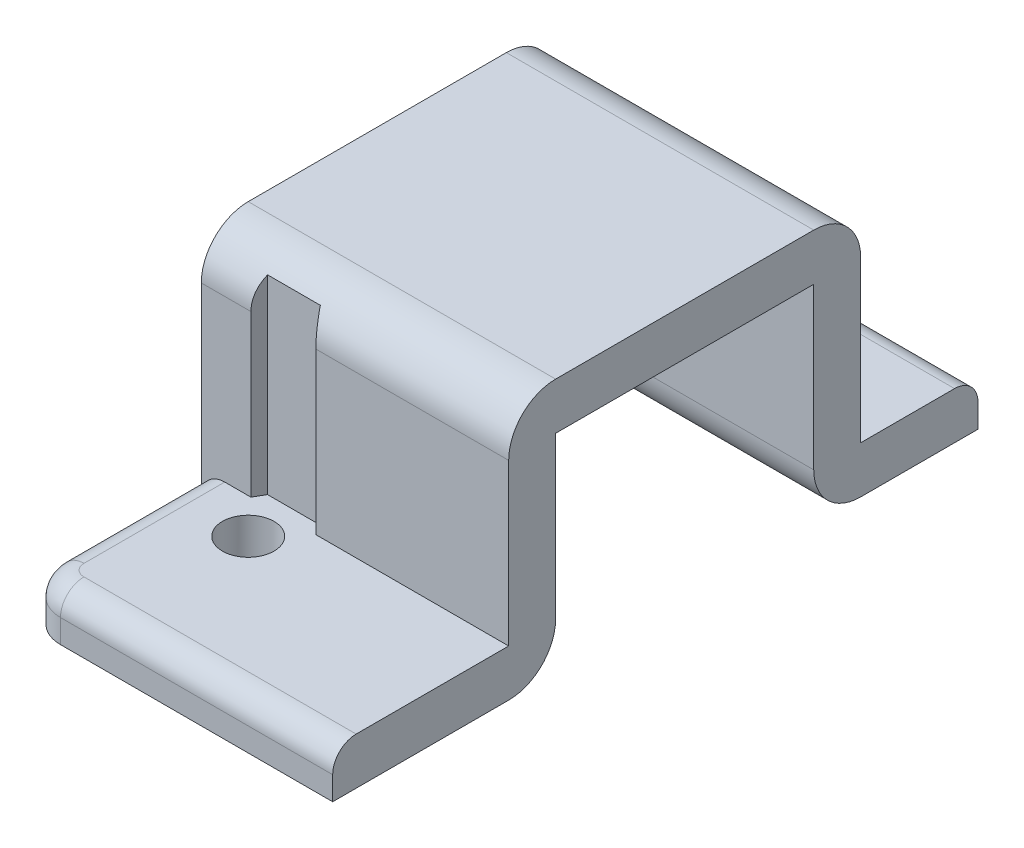
ISO-10303-21;
HEADER;
FILE_DESCRIPTION(('STEP AP214'),'2;1');
FILE_NAME('part.step','',(''),(''),'','','');
FILE_SCHEMA(('AUTOMOTIVE_DESIGN { 1 0 10303 214 1 1 1 1 }'));
ENDSEC;
DATA;
#1=APPLICATION_CONTEXT('core data for automotive mechanical design processes');
#2=APPLICATION_PROTOCOL_DEFINITION('international standard','automotive_design',2000,#1);
#3=PRODUCT_CONTEXT('',#1,'mechanical');
#4=PRODUCT('Part','Part','',(#3));
#5=PRODUCT_RELATED_PRODUCT_CATEGORY('part','',(#4));
#6=PRODUCT_DEFINITION_FORMATION('','',#4);
#7=PRODUCT_DEFINITION_CONTEXT('part definition',#1,'design');
#8=PRODUCT_DEFINITION('design','',#6,#7);
#9=PRODUCT_DEFINITION_SHAPE('','',#8);
#10=(LENGTH_UNIT() NAMED_UNIT(*) SI_UNIT(.MILLI.,.METRE.));
#11=(NAMED_UNIT(*) PLANE_ANGLE_UNIT() SI_UNIT($,.RADIAN.));
#12=(NAMED_UNIT(*) SI_UNIT($,.STERADIAN.) SOLID_ANGLE_UNIT());
#13=UNCERTAINTY_MEASURE_WITH_UNIT(LENGTH_MEASURE(1.E-05),#10,'distance_accuracy_value','');
#14=(GEOMETRIC_REPRESENTATION_CONTEXT(3) GLOBAL_UNCERTAINTY_ASSIGNED_CONTEXT((#13)) GLOBAL_UNIT_ASSIGNED_CONTEXT((#10,
#11,#12)) REPRESENTATION_CONTEXT('',''));
#15=CARTESIAN_POINT('',(0.,0.,0.));
#16=DIRECTION('',(0.,0.,1.));
#17=DIRECTION('',(1.,0.,0.));
#18=AXIS2_PLACEMENT_3D('',#15,#16,#17);
#19=CARTESIAN_POINT('',(6.55,0.,-7.5));
#20=DIRECTION('',(0.,0.,1.));
#21=DIRECTION('',(0.,-1.,0.));
#22=AXIS2_PLACEMENT_3D('',#19,#20,#21);
#23=PLANE('',#22);
#24=DIRECTION('',(0.,1.,0.));
#25=VECTOR('',#24,1.);
#26=CARTESIAN_POINT('',(-6.55,0.,-7.5));
#27=LINE('',#26,#25);
#28=CARTESIAN_POINT('',(-6.55,1.,-7.5));
#29=VERTEX_POINT('',#28);
#30=CARTESIAN_POINT('',(-6.55,8.85,-7.5));
#31=VERTEX_POINT('',#30);
#32=EDGE_CURVE('E500',#29,#31,#27,.T.);
#33=ORIENTED_EDGE('',*,*,#32,.T.);
#34=DIRECTION('',(1.,0.,0.));
#35=VECTOR('',#34,1.);
#36=CARTESIAN_POINT('',(-5.49198729810778,8.85,-7.5));
#37=LINE('',#36,#35);
#38=CARTESIAN_POINT('',(-4.43397459621556,8.85,-7.5));
#39=VERTEX_POINT('',#38);
#40=EDGE_CURVE('E266',#31,#39,#37,.T.);
#41=ORIENTED_EDGE('',*,*,#40,.T.);
#42=DIRECTION('',(0.,1.,0.));
#43=VECTOR('',#42,1.);
#44=CARTESIAN_POINT('',(-4.43397459621556,10.851,-7.5));
#45=LINE('',#44,#43);
#46=CARTESIAN_POINT('',(-4.43397459621556,2.,-7.5));
#47=VERTEX_POINT('',#46);
#48=EDGE_CURVE('E249',#47,#39,#45,.T.);
#49=ORIENTED_EDGE('',*,*,#48,.F.);
#50=DIRECTION('',(-1.,0.,0.));
#51=VECTOR('',#50,1.);
#52=CARTESIAN_POINT('',(6.55,2.,-7.5));
#53=LINE('',#52,#51);
#54=CARTESIAN_POINT('',(-5.55,2.,-7.5));
#55=VERTEX_POINT('',#54);
#56=EDGE_CURVE('E263',#47,#55,#53,.T.);
#57=ORIENTED_EDGE('',*,*,#56,.T.);
#58=CARTESIAN_POINT('',(-5.55,1.,-7.5));
#59=DIRECTION('',(0.,0.,1.));
#60=DIRECTION('',(0.,-1.,0.));
#61=AXIS2_PLACEMENT_3D('',#58,#59,#60);
#62=CIRCLE('',#61,1.);
#63=EDGE_CURVE('E11',#55,#29,#62,.T.);
#64=ORIENTED_EDGE('',*,*,#63,.T.);
#65=EDGE_LOOP('',(#33,#41,#49,#57,#64));
#66=FACE_BOUND('',#65,.T.);
#67=ADVANCED_FACE('F43',(#66),#23,.F.);
#68=CARTESIAN_POINT('',(6.55,10.85,0.));
#69=DIRECTION('',(0.,1.,0.));
#70=DIRECTION('',(0.,0.,1.));
#71=AXIS2_PLACEMENT_3D('',#68,#69,#70);
#72=PLANE('',#71);
#73=DIRECTION('',(0.,0.,-1.));
#74=VECTOR('',#73,1.);
#75=CARTESIAN_POINT('',(-6.55,10.85,0.));
#76=LINE('',#75,#74);
#77=CARTESIAN_POINT('',(-6.55,10.85,5.5));
#78=VERTEX_POINT('',#77);
#79=CARTESIAN_POINT('',(-6.55,10.85,-5.5));
#80=VERTEX_POINT('',#79);
#81=EDGE_CURVE('E503',#78,#80,#76,.T.);
#82=ORIENTED_EDGE('',*,*,#81,.F.);
#83=DIRECTION('',(-1.,0.,0.));
#84=VECTOR('',#83,1.);
#85=CARTESIAN_POINT('',(6.55,10.85,5.5));
#86=LINE('',#85,#84);
#87=CARTESIAN_POINT('',(6.55,10.85,5.5));
#88=VERTEX_POINT('',#87);
#89=EDGE_CURVE('E343',#78,#88,#86,.F.);
#90=ORIENTED_EDGE('',*,*,#89,.T.);
#91=DIRECTION('',(0.,0.,-1.));
#92=VECTOR('',#91,1.);
#93=CARTESIAN_POINT('',(6.55,10.85,0.));
#94=LINE('',#93,#92);
#95=CARTESIAN_POINT('',(6.55,10.85,-5.5));
#96=VERTEX_POINT('',#95);
#97=EDGE_CURVE('E459',#88,#96,#94,.T.);
#98=ORIENTED_EDGE('',*,*,#97,.T.);
#99=DIRECTION('',(-1.,0.,0.));
#100=VECTOR('',#99,1.);
#101=CARTESIAN_POINT('',(-1.66602540378444,10.85,-5.5));
#102=LINE('',#101,#100);
#103=EDGE_CURVE('E339',#96,#80,#102,.T.);
#104=ORIENTED_EDGE('',*,*,#103,.T.);
#105=EDGE_LOOP('',(#82,#90,#98,#104));
#106=FACE_BOUND('',#105,.T.);
#107=ADVANCED_FACE('F684',(#106),#72,.T.);
#108=CARTESIAN_POINT('',(6.55,0.,7.5));
#109=DIRECTION('',(0.,0.,1.));
#110=DIRECTION('',(0.,-1.,0.));
#111=AXIS2_PLACEMENT_3D('',#108,#109,#110);
#112=PLANE('',#111);
#113=DIRECTION('',(0.,-1.,0.));
#114=VECTOR('',#113,1.);
#115=CARTESIAN_POINT('',(-4.43397459621556,10.851,7.5));
#116=LINE('',#115,#114);
#117=CARTESIAN_POINT('',(-4.43397459621556,8.85,7.5));
#118=VERTEX_POINT('',#117);
#119=CARTESIAN_POINT('',(-4.43397459621556,2.,7.5));
#120=VERTEX_POINT('',#119);
#121=EDGE_CURVE('E644',#118,#120,#116,.T.);
#122=ORIENTED_EDGE('',*,*,#121,.F.);
#123=DIRECTION('',(-1.,0.,0.));
#124=VECTOR('',#123,1.);
#125=CARTESIAN_POINT('',(-5.49198729810778,8.85,7.5));
#126=LINE('',#125,#124);
#127=CARTESIAN_POINT('',(-6.55,8.85,7.5));
#128=VERTEX_POINT('',#127);
#129=EDGE_CURVE('E336',#118,#128,#126,.T.);
#130=ORIENTED_EDGE('',*,*,#129,.T.);
#131=DIRECTION('',(0.,1.,0.));
#132=VECTOR('',#131,1.);
#133=CARTESIAN_POINT('',(-6.55,0.,7.5));
#134=LINE('',#133,#132);
#135=CARTESIAN_POINT('',(-6.55,1.,7.5));
#136=VERTEX_POINT('',#135);
#137=EDGE_CURVE('E508',#136,#128,#134,.T.);
#138=ORIENTED_EDGE('',*,*,#137,.F.);
#139=CARTESIAN_POINT('',(-5.55,1.,7.5));
#140=DIRECTION('',(0.,0.,1.));
#141=DIRECTION('',(0.,-1.,0.));
#142=AXIS2_PLACEMENT_3D('',#139,#140,#141);
#143=CIRCLE('',#142,1.);
#144=CARTESIAN_POINT('',(-5.55,2.,7.5));
#145=VERTEX_POINT('',#144);
#146=EDGE_CURVE('E53',#136,#145,#143,.F.);
#147=ORIENTED_EDGE('',*,*,#146,.T.);
#148=DIRECTION('',(-1.,0.,0.));
#149=VECTOR('',#148,1.);
#150=CARTESIAN_POINT('',(6.55,2.,7.5));
#151=LINE('',#150,#149);
#152=EDGE_CURVE('E282',#120,#145,#151,.T.);
#153=ORIENTED_EDGE('',*,*,#152,.F.);
#154=EDGE_LOOP('',(#122,#130,#138,#147,#153));
#155=FACE_BOUND('',#154,.T.);
#156=ADVANCED_FACE('F690',(#155),#112,.T.);
#157=DIRECTION('',(0.,1.,0.));
#158=VECTOR('',#157,1.);
#159=CARTESIAN_POINT('',(6.55,0.,7.5));
#160=LINE('',#159,#158);
#161=CARTESIAN_POINT('',(6.55,2.,7.5));
#162=VERTEX_POINT('',#161);
#163=CARTESIAN_POINT('',(6.55,8.85,7.5));
#164=VERTEX_POINT('',#163);
#165=EDGE_CURVE('E471',#162,#164,#160,.T.);
#166=ORIENTED_EDGE('',*,*,#165,.T.);
#167=DIRECTION('',(-1.,0.,0.));
#168=VECTOR('',#167,1.);
#169=CARTESIAN_POINT('',(6.55,8.85,7.5));
#170=LINE('',#169,#168);
#171=CARTESIAN_POINT('',(-1.66602540378444,8.85,7.5));
#172=VERTEX_POINT('',#171);
#173=EDGE_CURVE('E323',#164,#172,#170,.T.);
#174=ORIENTED_EDGE('',*,*,#173,.T.);
#175=DIRECTION('',(0.,1.,0.));
#176=VECTOR('',#175,1.);
#177=CARTESIAN_POINT('',(-1.66602540378444,10.851,7.5));
#178=LINE('',#177,#176);
#179=CARTESIAN_POINT('',(-1.66602540378444,2.,7.5));
#180=VERTEX_POINT('',#179);
#181=EDGE_CURVE('E639',#180,#172,#178,.T.);
#182=ORIENTED_EDGE('',*,*,#181,.F.);
#183=EDGE_CURVE('E275',#162,#180,#151,.T.);
#184=ORIENTED_EDGE('',*,*,#183,.F.);
#185=EDGE_LOOP('',(#166,#174,#182,#184));
#186=FACE_BOUND('',#185,.T.);
#187=ADVANCED_FACE('F702',(#186),#112,.T.);
#188=CARTESIAN_POINT('',(6.55,2.,0.));
#189=DIRECTION('',(0.,1.,0.));
#190=DIRECTION('',(0.,0.,1.));
#191=AXIS2_PLACEMENT_3D('',#188,#189,#190);
#192=PLANE('',#191);
#193=CARTESIAN_POINT('',(-3.05,2.,-9.));
#194=DIRECTION('',(0.,-1.,0.));
#195=DIRECTION('',(0.,0.,-1.));
#196=AXIS2_PLACEMENT_3D('',#193,#194,#195);
#197=CIRCLE('',#196,1.1);
#198=CARTESIAN_POINT('',(-3.05,2.,-10.1));
#199=VERTEX_POINT('',#198);
#200=EDGE_CURVE('E631',#199,#199,#197,.T.);
#201=ORIENTED_EDGE('',*,*,#200,.T.);
#202=EDGE_LOOP('',(#201));
#203=FACE_BOUND('',#202,.T.);
#204=CARTESIAN_POINT('',(-5.05,2.,-11.));
#205=DIRECTION('',(0.,1.,0.));
#206=DIRECTION('',(0.,0.,1.));
#207=AXIS2_PLACEMENT_3D('',#204,#205,#206);
#208=CIRCLE('',#207,0.5);
#209=CARTESIAN_POINT('',(-5.05,2.,-11.5));
#210=VERTEX_POINT('',#209);
#211=CARTESIAN_POINT('',(-5.55,2.,-11.));
#212=VERTEX_POINT('',#211);
#213=EDGE_CURVE('E403',#210,#212,#208,.T.);
#214=ORIENTED_EDGE('',*,*,#213,.T.);
#215=DIRECTION('',(0.,0.,-1.));
#216=VECTOR('',#215,1.);
#217=CARTESIAN_POINT('',(-5.55,2.,-7.5));
#218=LINE('',#217,#216);
#219=EDGE_CURVE('E272',#212,#55,#218,.F.);
#220=ORIENTED_EDGE('',*,*,#219,.T.);
#221=ORIENTED_EDGE('',*,*,#56,.F.);
#222=DIRECTION('',(-0.5,0.,-0.866025403784439));
#223=VECTOR('',#222,1.);
#224=CARTESIAN_POINT('',(-4.175,2.,-7.05144284148501));
#225=LINE('',#224,#223);
#226=CARTESIAN_POINT('',(-4.175,2.,-7.05144284148501));
#227=VERTEX_POINT('',#226);
#228=EDGE_CURVE('E246',#227,#47,#225,.T.);
#229=ORIENTED_EDGE('',*,*,#228,.F.);
#230=DIRECTION('',(-1.,0.,0.));
#231=VECTOR('',#230,1.);
#232=CARTESIAN_POINT('',(-1.925,2.,-7.05144284148501));
#233=LINE('',#232,#231);
#234=CARTESIAN_POINT('',(-1.925,2.,-7.05144284148501));
#235=VERTEX_POINT('',#234);
#236=EDGE_CURVE('E258',#235,#227,#233,.T.);
#237=ORIENTED_EDGE('',*,*,#236,.F.);
#238=DIRECTION('',(-0.5,0.,0.866025403784439));
#239=VECTOR('',#238,1.);
#240=CARTESIAN_POINT('',(-0.8,2.,-9.));
#241=LINE('',#240,#239);
#242=CARTESIAN_POINT('',(-1.66602540378444,2.,-7.5));
#243=VERTEX_POINT('',#242);
#244=EDGE_CURVE('E633',#243,#235,#241,.T.);
#245=ORIENTED_EDGE('',*,*,#244,.F.);
#246=CARTESIAN_POINT('',(6.55,2.,-7.5));
#247=VERTEX_POINT('',#246);
#248=EDGE_CURVE('E274',#247,#243,#53,.T.);
#249=ORIENTED_EDGE('',*,*,#248,.F.);
#250=DIRECTION('',(0.,0.,-1.));
#251=VECTOR('',#250,1.);
#252=CARTESIAN_POINT('',(6.55,2.,0.));
#253=LINE('',#252,#251);
#254=CARTESIAN_POINT('',(6.55,2.,-11.5));
#255=VERTEX_POINT('',#254);
#256=EDGE_CURVE('E448',#247,#255,#253,.T.);
#257=ORIENTED_EDGE('',*,*,#256,.T.);
#258=DIRECTION('',(-1.,0.,0.));
#259=VECTOR('',#258,1.);
#260=CARTESIAN_POINT('',(6.55,2.,-11.5));
#261=LINE('',#260,#259);
#262=EDGE_CURVE('E400',#255,#210,#261,.T.);
#263=ORIENTED_EDGE('',*,*,#262,.T.);
#264=EDGE_LOOP('',(#214,#220,#221,#229,#237,#245,#249,#257,#263));
#265=FACE_BOUND('',#264,.T.);
#266=ADVANCED_FACE('F270',(#203,#265),#192,.T.);
#267=DIRECTION('',(0.,-1.,0.));
#268=VECTOR('',#267,1.);
#269=CARTESIAN_POINT('',(-1.66602540378444,10.851,-7.5));
#270=LINE('',#269,#268);
#271=CARTESIAN_POINT('',(-1.66602540378444,8.85,-7.5));
#272=VERTEX_POINT('',#271);
#273=EDGE_CURVE('E268',#272,#243,#270,.T.);
#274=ORIENTED_EDGE('',*,*,#273,.F.);
#275=DIRECTION('',(-1.,0.,0.));
#276=VECTOR('',#275,1.);
#277=CARTESIAN_POINT('',(6.55,8.85,-7.5));
#278=LINE('',#277,#276);
#279=CARTESIAN_POINT('',(6.55,8.85,-7.5));
#280=VERTEX_POINT('',#279);
#281=EDGE_CURVE('E357',#272,#280,#278,.F.);
#282=ORIENTED_EDGE('',*,*,#281,.T.);
#283=DIRECTION('',(0.,1.,0.));
#284=VECTOR('',#283,1.);
#285=CARTESIAN_POINT('',(6.55,0.,-7.5));
#286=LINE('',#285,#284);
#287=EDGE_CURVE('E454',#247,#280,#286,.T.);
#288=ORIENTED_EDGE('',*,*,#287,.F.);
#289=ORIENTED_EDGE('',*,*,#248,.T.);
#290=EDGE_LOOP('',(#274,#282,#288,#289));
#291=FACE_BOUND('',#290,.T.);
#292=ADVANCED_FACE('F686',(#291),#23,.F.);
#293=CARTESIAN_POINT('',(6.55,2.,0.));
#294=DIRECTION('',(0.,-1.,0.));
#295=DIRECTION('',(0.,0.,-1.));
#296=AXIS2_PLACEMENT_3D('',#293,#294,#295);
#297=PLANE('',#296);
#298=CARTESIAN_POINT('',(-3.05,2.,9.));
#299=DIRECTION('',(0.,1.,0.));
#300=DIRECTION('',(0.,0.,1.));
#301=AXIS2_PLACEMENT_3D('',#298,#299,#300);
#302=CIRCLE('',#301,1.1);
#303=CARTESIAN_POINT('',(-3.05,2.,10.1));
#304=VERTEX_POINT('',#303);
#305=EDGE_CURVE('E504',#304,#304,#302,.T.);
#306=ORIENTED_EDGE('',*,*,#305,.F.);
#307=EDGE_LOOP('',(#306));
#308=FACE_BOUND('',#307,.T.);
#309=ORIENTED_EDGE('',*,*,#152,.T.);
#310=DIRECTION('',(0.,0.,1.));
#311=VECTOR('',#310,1.);
#312=CARTESIAN_POINT('',(-5.55,2.,0.));
#313=LINE('',#312,#311);
#314=CARTESIAN_POINT('',(-5.55,2.,13.5));
#315=VERTEX_POINT('',#314);
#316=EDGE_CURVE('E385',#145,#315,#313,.T.);
#317=ORIENTED_EDGE('',*,*,#316,.T.);
#318=CARTESIAN_POINT('',(-5.05,2.,13.5));
#319=DIRECTION('',(0.,-1.,0.));
#320=DIRECTION('',(0.,0.,-1.));
#321=AXIS2_PLACEMENT_3D('',#318,#319,#320);
#322=CIRCLE('',#321,0.5);
#323=CARTESIAN_POINT('',(-5.05,2.,14.));
#324=VERTEX_POINT('',#323);
#325=EDGE_CURVE('E382',#315,#324,#322,.F.);
#326=ORIENTED_EDGE('',*,*,#325,.T.);
#327=DIRECTION('',(-1.,0.,0.));
#328=VECTOR('',#327,1.);
#329=CARTESIAN_POINT('',(6.55,2.,14.));
#330=LINE('',#329,#328);
#331=CARTESIAN_POINT('',(6.55,2.,14.));
#332=VERTEX_POINT('',#331);
#333=EDGE_CURVE('E379',#324,#332,#330,.F.);
#334=ORIENTED_EDGE('',*,*,#333,.T.);
#335=DIRECTION('',(0.,0.,1.));
#336=VECTOR('',#335,1.);
#337=CARTESIAN_POINT('',(6.55,2.,0.));
#338=LINE('',#337,#336);
#339=EDGE_CURVE('E475',#162,#332,#338,.T.);
#340=ORIENTED_EDGE('',*,*,#339,.F.);
#341=ORIENTED_EDGE('',*,*,#183,.T.);
#342=DIRECTION('',(-0.5,0.,-0.866025403784439));
#343=VECTOR('',#342,1.);
#344=CARTESIAN_POINT('',(-0.8,2.,9.));
#345=LINE('',#344,#343);
#346=CARTESIAN_POINT('',(-1.925,2.,7.05144284148501));
#347=VERTEX_POINT('',#346);
#348=EDGE_CURVE('E649',#180,#347,#345,.T.);
#349=ORIENTED_EDGE('',*,*,#348,.T.);
#350=DIRECTION('',(-1.,0.,0.));
#351=VECTOR('',#350,1.);
#352=CARTESIAN_POINT('',(-1.925,2.,7.05144284148501));
#353=LINE('',#352,#351);
#354=CARTESIAN_POINT('',(-4.175,2.,7.05144284148501));
#355=VERTEX_POINT('',#354);
#356=EDGE_CURVE('E653',#347,#355,#353,.T.);
#357=ORIENTED_EDGE('',*,*,#356,.T.);
#358=DIRECTION('',(-0.5,0.,0.866025403784439));
#359=VECTOR('',#358,1.);
#360=CARTESIAN_POINT('',(-4.175,2.,7.05144284148501));
#361=LINE('',#360,#359);
#362=EDGE_CURVE('E550',#355,#120,#361,.T.);
#363=ORIENTED_EDGE('',*,*,#362,.T.);
#364=EDGE_LOOP('',(#309,#317,#326,#334,#340,#341,#349,#357,#363));
#365=FACE_BOUND('',#364,.T.);
#366=ADVANCED_FACE('F547',(#308,#365),#297,.F.);
#367=CARTESIAN_POINT('',(6.55,0.,15.));
#368=DIRECTION('',(0.,0.,1.));
#369=DIRECTION('',(1.,0.,0.));
#370=AXIS2_PLACEMENT_3D('',#367,#368,#369);
#371=PLANE('',#370);
#372=DIRECTION('',(0.,1.,0.));
#373=VECTOR('',#372,1.);
#374=CARTESIAN_POINT('',(6.55,0.,15.));
#375=LINE('',#374,#373);
#376=CARTESIAN_POINT('',(6.55,0.,15.));
#377=VERTEX_POINT('',#376);
#378=CARTESIAN_POINT('',(6.55,0.999999999999999,15.));
#379=VERTEX_POINT('',#378);
#380=EDGE_CURVE('E478',#377,#379,#375,.T.);
#381=ORIENTED_EDGE('',*,*,#380,.T.);
#382=DIRECTION('',(-1.,0.,0.));
#383=VECTOR('',#382,1.);
#384=CARTESIAN_POINT('',(-5.05,0.999999999999999,15.));
#385=LINE('',#384,#383);
#386=CARTESIAN_POINT('',(-5.05,0.999999999999999,15.));
#387=VERTEX_POINT('',#386);
#388=EDGE_CURVE('E411',#379,#387,#385,.T.);
#389=ORIENTED_EDGE('',*,*,#388,.T.);
#390=DIRECTION('',(0.,1.,0.));
#391=VECTOR('',#390,1.);
#392=CARTESIAN_POINT('',(-5.05,0.,15.));
#393=LINE('',#392,#391);
#394=CARTESIAN_POINT('',(-5.05,0.,15.));
#395=VERTEX_POINT('',#394);
#396=EDGE_CURVE('E367',#387,#395,#393,.F.);
#397=ORIENTED_EDGE('',*,*,#396,.T.);
#398=DIRECTION('',(-1.,0.,0.));
#399=VECTOR('',#398,1.);
#400=CARTESIAN_POINT('',(6.55,0.,15.));
#401=LINE('',#400,#399);
#402=EDGE_CURVE('E535',#377,#395,#401,.T.);
#403=ORIENTED_EDGE('',*,*,#402,.F.);
#404=EDGE_LOOP('',(#381,#389,#397,#403));
#405=FACE_BOUND('',#404,.T.);
#406=ADVANCED_FACE('F570',(#405),#371,.T.);
#407=CARTESIAN_POINT('',(6.55,0.,0.));
#408=DIRECTION('',(0.,-1.,0.));
#409=DIRECTION('',(0.,0.,-1.));
#410=AXIS2_PLACEMENT_3D('',#407,#408,#409);
#411=PLANE('',#410);
#412=CARTESIAN_POINT('',(-3.05,0.,9.));
#413=DIRECTION('',(0.,-1.,0.));
#414=DIRECTION('',(0.,0.,-1.));
#415=AXIS2_PLACEMENT_3D('',#412,#413,#414);
#416=CIRCLE('',#415,1.1);
#417=CARTESIAN_POINT('',(-3.05,0.,7.9));
#418=VERTEX_POINT('',#417);
#419=EDGE_CURVE('E465',#418,#418,#416,.F.);
#420=ORIENTED_EDGE('',*,*,#419,.T.);
#421=EDGE_LOOP('',(#420));
#422=FACE_BOUND('',#421,.T.);
#423=ORIENTED_EDGE('',*,*,#402,.T.);
#424=CARTESIAN_POINT('',(-5.05,0.,13.5));
#425=DIRECTION('',(0.,-1.,0.));
#426=DIRECTION('',(0.,0.,-1.));
#427=AXIS2_PLACEMENT_3D('',#424,#425,#426);
#428=CIRCLE('',#427,1.5);
#429=CARTESIAN_POINT('',(-6.55,0.,13.5));
#430=VERTEX_POINT('',#429);
#431=EDGE_CURVE('E370',#395,#430,#428,.T.);
#432=ORIENTED_EDGE('',*,*,#431,.T.);
#433=DIRECTION('',(0.,0.,1.));
#434=VECTOR('',#433,1.);
#435=CARTESIAN_POINT('',(-6.55,0.,0.));
#436=LINE('',#435,#434);
#437=CARTESIAN_POINT('',(-6.55,0.,7.5));
#438=VERTEX_POINT('',#437);
#439=EDGE_CURVE('E512',#438,#430,#436,.T.);
#440=ORIENTED_EDGE('',*,*,#439,.F.);
#441=DIRECTION('',(-1.,0.,0.));
#442=VECTOR('',#441,1.);
#443=CARTESIAN_POINT('',(6.55,0.,7.5));
#444=LINE('',#443,#442);
#445=CARTESIAN_POINT('',(6.55,0.,7.5));
#446=VERTEX_POINT('',#445);
#447=EDGE_CURVE('E320',#438,#446,#444,.F.);
#448=ORIENTED_EDGE('',*,*,#447,.T.);
#449=DIRECTION('',(0.,0.,1.));
#450=VECTOR('',#449,1.);
#451=CARTESIAN_POINT('',(6.55,0.,0.));
#452=LINE('',#451,#450);
#453=EDGE_CURVE('E481',#446,#377,#452,.T.);
#454=ORIENTED_EDGE('',*,*,#453,.T.);
#455=EDGE_LOOP('',(#423,#432,#440,#448,#454));
#456=FACE_BOUND('',#455,.T.);
#457=ADVANCED_FACE('F575',(#422,#456),#411,.T.);
#458=CARTESIAN_POINT('',(6.55,0.,5.5));
#459=DIRECTION('',(0.,0.,1.));
#460=DIRECTION('',(0.,-1.,0.));
#461=AXIS2_PLACEMENT_3D('',#458,#459,#460);
#462=PLANE('',#461);
#463=DIRECTION('',(0.,1.,0.));
#464=VECTOR('',#463,1.);
#465=CARTESIAN_POINT('',(6.55,0.,5.5));
#466=LINE('',#465,#464);
#467=CARTESIAN_POINT('',(6.55,2.,5.5));
#468=VERTEX_POINT('',#467);
#469=CARTESIAN_POINT('',(6.55,8.85,5.5));
#470=VERTEX_POINT('',#469);
#471=EDGE_CURVE('E484',#468,#470,#466,.T.);
#472=ORIENTED_EDGE('',*,*,#471,.F.);
#473=DIRECTION('',(-1.,0.,0.));
#474=VECTOR('',#473,1.);
#475=CARTESIAN_POINT('',(-6.55,2.,5.5));
#476=LINE('',#475,#474);
#477=CARTESIAN_POINT('',(-6.55,2.,5.5));
#478=VERTEX_POINT('',#477);
#479=EDGE_CURVE('E316',#468,#478,#476,.T.);
#480=ORIENTED_EDGE('',*,*,#479,.T.);
#481=DIRECTION('',(0.,1.,0.));
#482=VECTOR('',#481,1.);
#483=CARTESIAN_POINT('',(-6.55,0.,5.5));
#484=LINE('',#483,#482);
#485=CARTESIAN_POINT('',(-6.55,8.85,5.5));
#486=VERTEX_POINT('',#485);
#487=EDGE_CURVE('E516',#478,#486,#484,.T.);
#488=ORIENTED_EDGE('',*,*,#487,.T.);
#489=DIRECTION('',(-1.,0.,0.));
#490=VECTOR('',#489,1.);
#491=CARTESIAN_POINT('',(6.55,8.85,5.5));
#492=LINE('',#491,#490);
#493=EDGE_CURVE('E532',#470,#486,#492,.T.);
#494=ORIENTED_EDGE('',*,*,#493,.F.);
#495=EDGE_LOOP('',(#472,#480,#488,#494));
#496=FACE_BOUND('',#495,.T.);
#497=ADVANCED_FACE('F587',(#496),#462,.F.);
#498=CARTESIAN_POINT('',(6.55,8.85,0.));
#499=DIRECTION('',(0.,1.,0.));
#500=DIRECTION('',(0.,0.,1.));
#501=AXIS2_PLACEMENT_3D('',#498,#499,#500);
#502=PLANE('',#501);
#503=DIRECTION('',(0.,0.,-1.));
#504=VECTOR('',#503,1.);
#505=CARTESIAN_POINT('',(-6.55,8.85,0.));
#506=LINE('',#505,#504);
#507=CARTESIAN_POINT('',(-6.55,8.85,-5.5));
#508=VERTEX_POINT('',#507);
#509=EDGE_CURVE('E519',#486,#508,#506,.T.);
#510=ORIENTED_EDGE('',*,*,#509,.T.);
#511=DIRECTION('',(-1.,0.,0.));
#512=VECTOR('',#511,1.);
#513=CARTESIAN_POINT('',(6.55,8.85,-5.5));
#514=LINE('',#513,#512);
#515=CARTESIAN_POINT('',(6.55,8.85,-5.5));
#516=VERTEX_POINT('',#515);
#517=EDGE_CURVE('E528',#516,#508,#514,.T.);
#518=ORIENTED_EDGE('',*,*,#517,.F.);
#519=DIRECTION('',(0.,0.,-1.));
#520=VECTOR('',#519,1.);
#521=CARTESIAN_POINT('',(6.55,8.85,0.));
#522=LINE('',#521,#520);
#523=EDGE_CURVE('E487',#470,#516,#522,.T.);
#524=ORIENTED_EDGE('',*,*,#523,.F.);
#525=ORIENTED_EDGE('',*,*,#493,.T.);
#526=EDGE_LOOP('',(#510,#518,#524,#525));
#527=FACE_BOUND('',#526,.T.);
#528=ADVANCED_FACE('F595',(#527),#502,.F.);
#529=CARTESIAN_POINT('',(6.55,0.,-5.5));
#530=DIRECTION('',(0.,0.,-1.));
#531=DIRECTION('',(0.,1.,0.));
#532=AXIS2_PLACEMENT_3D('',#529,#530,#531);
#533=PLANE('',#532);
#534=DIRECTION('',(0.,-1.,0.));
#535=VECTOR('',#534,1.);
#536=CARTESIAN_POINT('',(-6.55,0.,-5.5));
#537=LINE('',#536,#535);
#538=CARTESIAN_POINT('',(-6.55,2.,-5.5));
#539=VERTEX_POINT('',#538);
#540=EDGE_CURVE('E462',#508,#539,#537,.T.);
#541=ORIENTED_EDGE('',*,*,#540,.T.);
#542=DIRECTION('',(-1.,0.,0.));
#543=VECTOR('',#542,1.);
#544=CARTESIAN_POINT('',(6.55,2.,-5.5));
#545=LINE('',#544,#543);
#546=CARTESIAN_POINT('',(6.55,2.,-5.5));
#547=VERTEX_POINT('',#546);
#548=EDGE_CURVE('E301',#539,#547,#545,.F.);
#549=ORIENTED_EDGE('',*,*,#548,.T.);
#550=DIRECTION('',(0.,-1.,0.));
#551=VECTOR('',#550,1.);
#552=CARTESIAN_POINT('',(6.55,0.,-5.5));
#553=LINE('',#552,#551);
#554=EDGE_CURVE('E490',#516,#547,#553,.T.);
#555=ORIENTED_EDGE('',*,*,#554,.F.);
#556=ORIENTED_EDGE('',*,*,#517,.T.);
#557=EDGE_LOOP('',(#541,#549,#555,#556));
#558=FACE_BOUND('',#557,.T.);
#559=ADVANCED_FACE('F598',(#558),#533,.F.);
#560=CARTESIAN_POINT('',(6.55,0.,0.));
#561=DIRECTION('',(0.,1.,0.));
#562=DIRECTION('',(0.,0.,1.));
#563=AXIS2_PLACEMENT_3D('',#560,#561,#562);
#564=PLANE('',#563);
#565=CARTESIAN_POINT('',(-3.05,0.,-9.));
#566=DIRECTION('',(0.,1.,0.));
#567=DIRECTION('',(0.,0.,1.));
#568=AXIS2_PLACEMENT_3D('',#565,#566,#567);
#569=CIRCLE('',#568,1.1);
#570=CARTESIAN_POINT('',(-3.05,0.,-7.9));
#571=VERTEX_POINT('',#570);
#572=EDGE_CURVE('E625',#571,#571,#569,.T.);
#573=ORIENTED_EDGE('',*,*,#572,.T.);
#574=EDGE_LOOP('',(#573));
#575=FACE_BOUND('',#574,.T.);
#576=DIRECTION('',(0.,0.,-1.));
#577=VECTOR('',#576,1.);
#578=CARTESIAN_POINT('',(-6.55,0.,0.));
#579=LINE('',#578,#577);
#580=CARTESIAN_POINT('',(-6.55,0.,-7.5));
#581=VERTEX_POINT('',#580);
#582=CARTESIAN_POINT('',(-6.55,0.,-11.));
#583=VERTEX_POINT('',#582);
#584=EDGE_CURVE('E455',#581,#583,#579,.T.);
#585=ORIENTED_EDGE('',*,*,#584,.T.);
#586=CARTESIAN_POINT('',(-5.05,0.,-11.));
#587=DIRECTION('',(0.,1.,0.));
#588=DIRECTION('',(0.,0.,1.));
#589=AXIS2_PLACEMENT_3D('',#586,#587,#588);
#590=CIRCLE('',#589,1.5);
#591=CARTESIAN_POINT('',(-5.05,0.,-12.5));
#592=VERTEX_POINT('',#591);
#593=EDGE_CURVE('E373',#583,#592,#590,.F.);
#594=ORIENTED_EDGE('',*,*,#593,.T.);
#595=DIRECTION('',(-1.,0.,0.));
#596=VECTOR('',#595,1.);
#597=CARTESIAN_POINT('',(6.55,0.,-12.5));
#598=LINE('',#597,#596);
#599=CARTESIAN_POINT('',(6.55,0.,-12.5));
#600=VERTEX_POINT('',#599);
#601=EDGE_CURVE('E499',#600,#592,#598,.T.);
#602=ORIENTED_EDGE('',*,*,#601,.F.);
#603=DIRECTION('',(0.,0.,-1.));
#604=VECTOR('',#603,1.);
#605=CARTESIAN_POINT('',(6.55,0.,0.));
#606=LINE('',#605,#604);
#607=CARTESIAN_POINT('',(6.55,0.,-7.5));
#608=VERTEX_POINT('',#607);
#609=EDGE_CURVE('E494',#608,#600,#606,.T.);
#610=ORIENTED_EDGE('',*,*,#609,.F.);
#611=DIRECTION('',(-1.,0.,0.));
#612=VECTOR('',#611,1.);
#613=CARTESIAN_POINT('',(6.55,0.,-7.5));
#614=LINE('',#613,#612);
#615=EDGE_CURVE('E280',#608,#581,#614,.T.);
#616=ORIENTED_EDGE('',*,*,#615,.T.);
#617=EDGE_LOOP('',(#585,#594,#602,#610,#616));
#618=FACE_BOUND('',#617,.T.);
#619=ADVANCED_FACE('F606',(#575,#618),#564,.F.);
#620=CARTESIAN_POINT('',(6.55,0.,-12.5));
#621=DIRECTION('',(0.,0.,-1.));
#622=DIRECTION('',(-1.,0.,0.));
#623=AXIS2_PLACEMENT_3D('',#620,#621,#622);
#624=PLANE('',#623);
#625=DIRECTION('',(0.,-1.,0.));
#626=VECTOR('',#625,1.);
#627=CARTESIAN_POINT('',(-5.05,2.,-12.5));
#628=LINE('',#627,#626);
#629=CARTESIAN_POINT('',(-5.05,1.,-12.5));
#630=VERTEX_POINT('',#629);
#631=EDGE_CURVE('E376',#592,#630,#628,.F.);
#632=ORIENTED_EDGE('',*,*,#631,.T.);
#633=DIRECTION('',(-1.,0.,0.));
#634=VECTOR('',#633,1.);
#635=CARTESIAN_POINT('',(6.55,1.,-12.5));
#636=LINE('',#635,#634);
#637=CARTESIAN_POINT('',(6.55,1.,-12.5));
#638=VERTEX_POINT('',#637);
#639=EDGE_CURVE('E61',#630,#638,#636,.F.);
#640=ORIENTED_EDGE('',*,*,#639,.T.);
#641=DIRECTION('',(0.,-1.,0.));
#642=VECTOR('',#641,1.);
#643=CARTESIAN_POINT('',(6.55,0.,-12.5));
#644=LINE('',#643,#642);
#645=EDGE_CURVE('E450',#638,#600,#644,.T.);
#646=ORIENTED_EDGE('',*,*,#645,.T.);
#647=ORIENTED_EDGE('',*,*,#601,.T.);
#648=EDGE_LOOP('',(#632,#640,#646,#647));
#649=FACE_BOUND('',#648,.T.);
#650=ADVANCED_FACE('F610',(#649),#624,.T.);
#651=CARTESIAN_POINT('',(6.55,0.,0.));
#652=DIRECTION('',(1.,0.,0.));
#653=DIRECTION('',(0.,0.,-1.));
#654=AXIS2_PLACEMENT_3D('',#651,#652,#653);
#655=PLANE('',#654);
#656=ORIENTED_EDGE('',*,*,#339,.T.);
#657=CARTESIAN_POINT('',(6.55,0.999999999999999,14.));
#658=DIRECTION('',(1.,0.,0.));
#659=DIRECTION('',(0.,0.,-1.));
#660=AXIS2_PLACEMENT_3D('',#657,#658,#659);
#661=CIRCLE('',#660,1.);
#662=EDGE_CURVE('E69',#332,#379,#661,.T.);
#663=ORIENTED_EDGE('',*,*,#662,.T.);
#664=ORIENTED_EDGE('',*,*,#380,.F.);
#665=ORIENTED_EDGE('',*,*,#453,.F.);
#666=CARTESIAN_POINT('',(6.55,2.,7.5));
#667=DIRECTION('',(1.,0.,0.));
#668=DIRECTION('',(0.,0.,-1.));
#669=AXIS2_PLACEMENT_3D('',#666,#667,#668);
#670=CIRCLE('',#669,2.);
#671=EDGE_CURVE('E310',#446,#468,#670,.T.);
#672=ORIENTED_EDGE('',*,*,#671,.T.);
#673=ORIENTED_EDGE('',*,*,#471,.T.);
#674=ORIENTED_EDGE('',*,*,#523,.T.);
#675=ORIENTED_EDGE('',*,*,#554,.T.);
#676=CARTESIAN_POINT('',(6.55,2.,-7.5));
#677=DIRECTION('',(1.,0.,0.));
#678=DIRECTION('',(0.,0.,-1.));
#679=AXIS2_PLACEMENT_3D('',#676,#677,#678);
#680=CIRCLE('',#679,2.);
#681=EDGE_CURVE('E313',#547,#608,#680,.T.);
#682=ORIENTED_EDGE('',*,*,#681,.T.);
#683=ORIENTED_EDGE('',*,*,#609,.T.);
#684=ORIENTED_EDGE('',*,*,#645,.F.);
#685=CARTESIAN_POINT('',(6.55,1.,-11.5));
#686=DIRECTION('',(1.,0.,0.));
#687=DIRECTION('',(0.,0.,-1.));
#688=AXIS2_PLACEMENT_3D('',#685,#686,#687);
#689=CIRCLE('',#688,1.);
#690=EDGE_CURVE('E414',#638,#255,#689,.T.);
#691=ORIENTED_EDGE('',*,*,#690,.T.);
#692=ORIENTED_EDGE('',*,*,#256,.F.);
#693=ORIENTED_EDGE('',*,*,#287,.T.);
#694=CARTESIAN_POINT('',(6.55,8.85,-5.5));
#695=DIRECTION('',(1.,0.,0.));
#696=DIRECTION('',(0.,0.,-1.));
#697=AXIS2_PLACEMENT_3D('',#694,#695,#696);
#698=CIRCLE('',#697,2.);
#699=EDGE_CURVE('E304',#280,#96,#698,.T.);
#700=ORIENTED_EDGE('',*,*,#699,.T.);
#701=ORIENTED_EDGE('',*,*,#97,.F.);
#702=CARTESIAN_POINT('',(6.55,8.85,5.5));
#703=DIRECTION('',(1.,0.,0.));
#704=DIRECTION('',(0.,0.,-1.));
#705=AXIS2_PLACEMENT_3D('',#702,#703,#704);
#706=CIRCLE('',#705,2.);
#707=EDGE_CURVE('E307',#88,#164,#706,.T.);
#708=ORIENTED_EDGE('',*,*,#707,.T.);
#709=ORIENTED_EDGE('',*,*,#165,.F.);
#710=EDGE_LOOP('',(#656,#663,#664,#665,#672,#673,#674,#675,#682,#683,#684,#691,#692,#693,#700,
#701,#708,#709));
#711=FACE_BOUND('',#710,.T.);
#712=ADVANCED_FACE('F446',(#711),#655,.T.);
#713=CARTESIAN_POINT('',(-6.55,0.,0.));
#714=DIRECTION('',(1.,0.,0.));
#715=DIRECTION('',(0.,0.,-1.));
#716=AXIS2_PLACEMENT_3D('',#713,#714,#715);
#717=PLANE('',#716);
#718=DIRECTION('',(0.,1.,0.));
#719=VECTOR('',#718,1.);
#720=CARTESIAN_POINT('',(-6.55,2.,13.5));
#721=LINE('',#720,#719);
#722=CARTESIAN_POINT('',(-6.55,0.999999999999999,13.5));
#723=VERTEX_POINT('',#722);
#724=EDGE_CURVE('E363',#430,#723,#721,.T.);
#725=ORIENTED_EDGE('',*,*,#724,.T.);
#726=DIRECTION('',(0.,0.,1.));
#727=VECTOR('',#726,1.);
#728=CARTESIAN_POINT('',(-6.55,1.,0.));
#729=LINE('',#728,#727);
#730=EDGE_CURVE('E393',#723,#136,#729,.F.);
#731=ORIENTED_EDGE('',*,*,#730,.T.);
#732=ORIENTED_EDGE('',*,*,#137,.T.);
#733=CARTESIAN_POINT('',(-6.55,8.85,5.5));
#734=DIRECTION('',(1.,0.,0.));
#735=DIRECTION('',(0.,0.,-1.));
#736=AXIS2_PLACEMENT_3D('',#733,#734,#735);
#737=CIRCLE('',#736,2.);
#738=EDGE_CURVE('E292',#128,#78,#737,.F.);
#739=ORIENTED_EDGE('',*,*,#738,.T.);
#740=ORIENTED_EDGE('',*,*,#81,.T.);
#741=CARTESIAN_POINT('',(-6.55,8.85,-5.5));
#742=DIRECTION('',(1.,0.,0.));
#743=DIRECTION('',(0.,0.,-1.));
#744=AXIS2_PLACEMENT_3D('',#741,#742,#743);
#745=CIRCLE('',#744,2.);
#746=EDGE_CURVE('E289',#80,#31,#745,.F.);
#747=ORIENTED_EDGE('',*,*,#746,.T.);
#748=ORIENTED_EDGE('',*,*,#32,.F.);
#749=DIRECTION('',(0.,0.,-1.));
#750=VECTOR('',#749,1.);
#751=CARTESIAN_POINT('',(-6.55,1.,-11.));
#752=LINE('',#751,#750);
#753=CARTESIAN_POINT('',(-6.55,1.,-11.));
#754=VERTEX_POINT('',#753);
#755=EDGE_CURVE('E389',#29,#754,#752,.T.);
#756=ORIENTED_EDGE('',*,*,#755,.T.);
#757=DIRECTION('',(0.,-1.,0.));
#758=VECTOR('',#757,1.);
#759=CARTESIAN_POINT('',(-6.55,0.,-11.));
#760=LINE('',#759,#758);
#761=EDGE_CURVE('E360',#754,#583,#760,.T.);
#762=ORIENTED_EDGE('',*,*,#761,.T.);
#763=ORIENTED_EDGE('',*,*,#584,.F.);
#764=CARTESIAN_POINT('',(-6.55,2.,-7.5));
#765=DIRECTION('',(1.,0.,0.));
#766=DIRECTION('',(0.,0.,-1.));
#767=AXIS2_PLACEMENT_3D('',#764,#765,#766);
#768=CIRCLE('',#767,2.);
#769=EDGE_CURVE('E298',#581,#539,#768,.F.);
#770=ORIENTED_EDGE('',*,*,#769,.T.);
#771=ORIENTED_EDGE('',*,*,#540,.F.);
#772=ORIENTED_EDGE('',*,*,#509,.F.);
#773=ORIENTED_EDGE('',*,*,#487,.F.);
#774=CARTESIAN_POINT('',(-6.55,2.,7.5));
#775=DIRECTION('',(1.,0.,0.));
#776=DIRECTION('',(0.,0.,-1.));
#777=AXIS2_PLACEMENT_3D('',#774,#775,#776);
#778=CIRCLE('',#777,2.);
#779=EDGE_CURVE('E295',#478,#438,#778,.F.);
#780=ORIENTED_EDGE('',*,*,#779,.T.);
#781=ORIENTED_EDGE('',*,*,#439,.T.);
#782=EDGE_LOOP('',(#725,#731,#732,#739,#740,#747,#748,#756,#762,#763,#770,#771,#772,#773,#780,#781));
#783=FACE_BOUND('',#782,.T.);
#784=ADVANCED_FACE('F578',(#783),#717,.F.);
#785=CARTESIAN_POINT('',(-3.05,-0.001000000000001,9.));
#786=DIRECTION('',(0.,1.,0.));
#787=DIRECTION('',(0.,0.,1.));
#788=AXIS2_PLACEMENT_3D('',#785,#786,#787);
#789=CYLINDRICAL_SURFACE('',#788,1.1);
#790=ORIENTED_EDGE('',*,*,#419,.F.);
#791=EDGE_LOOP('',(#790));
#792=FACE_BOUND('',#791,.T.);
#793=ORIENTED_EDGE('',*,*,#305,.T.);
#794=EDGE_LOOP('',(#793));
#795=FACE_BOUND('',#794,.T.);
#796=ADVANCED_FACE('F670',(#792,#795),#789,.F.);
#797=CARTESIAN_POINT('',(-4.175,10.851,7.05144284148501));
#798=DIRECTION('',(0.866025403784439,0.,0.5));
#799=DIRECTION('',(0.5,0.,-0.866025403784439));
#800=AXIS2_PLACEMENT_3D('',#797,#798,#799);
#801=PLANE('',#800);
#802=DIRECTION('',(0.,-1.,0.));
#803=VECTOR('',#802,1.);
#804=CARTESIAN_POINT('',(-4.175,10.851,7.05144284148501));
#805=LINE('',#804,#803);
#806=CARTESIAN_POINT('',(-4.175,10.1121509852648,7.05144284148501));
#807=VERTEX_POINT('',#806);
#808=EDGE_CURVE('E656',#807,#355,#805,.T.);
#809=ORIENTED_EDGE('',*,*,#808,.F.);
#810=CARTESIAN_POINT('',(-3.27927405783631,8.85,5.5));
#811=DIRECTION('',(0.866025403784439,0.,0.5));
#812=DIRECTION('',(-0.5,0.,0.866025403784439));
#813=AXIS2_PLACEMENT_3D('',#810,#811,#812);
#814=ELLIPSE('',#813,2.3094010767585,2.);
#815=EDGE_CURVE('E333',#807,#118,#814,.T.);
#816=ORIENTED_EDGE('',*,*,#815,.T.);
#817=ORIENTED_EDGE('',*,*,#121,.T.);
#818=ORIENTED_EDGE('',*,*,#362,.F.);
#819=EDGE_LOOP('',(#809,#816,#817,#818));
#820=FACE_BOUND('',#819,.T.);
#821=ADVANCED_FACE('F672',(#820),#801,.T.);
#822=CARTESIAN_POINT('',(-0.8,10.851,9.));
#823=DIRECTION('',(-0.866025403784439,0.,0.5));
#824=DIRECTION('',(0.5,0.,0.866025403784439));
#825=AXIS2_PLACEMENT_3D('',#822,#823,#824);
#826=PLANE('',#825);
#827=ORIENTED_EDGE('',*,*,#181,.T.);
#828=CARTESIAN_POINT('',(-2.82072594216369,8.85,5.5));
#829=DIRECTION('',(-0.866025403784439,0.,0.5));
#830=DIRECTION('',(-0.5,0.,-0.866025403784439));
#831=AXIS2_PLACEMENT_3D('',#828,#829,#830);
#832=ELLIPSE('',#831,2.3094010767585,2.);
#833=CARTESIAN_POINT('',(-1.925,10.1121509852648,7.05144284148501));
#834=VERTEX_POINT('',#833);
#835=EDGE_CURVE('E327',#172,#834,#832,.T.);
#836=ORIENTED_EDGE('',*,*,#835,.T.);
#837=DIRECTION('',(0.,-1.,0.));
#838=VECTOR('',#837,1.);
#839=CARTESIAN_POINT('',(-1.925,10.851,7.05144284148501));
#840=LINE('',#839,#838);
#841=EDGE_CURVE('E659',#834,#347,#840,.T.);
#842=ORIENTED_EDGE('',*,*,#841,.T.);
#843=ORIENTED_EDGE('',*,*,#348,.F.);
#844=EDGE_LOOP('',(#827,#836,#842,#843));
#845=FACE_BOUND('',#844,.T.);
#846=ADVANCED_FACE('F678',(#845),#826,.T.);
#847=CARTESIAN_POINT('',(-1.925,10.851,7.05144284148501));
#848=DIRECTION('',(0.,0.,1.));
#849=DIRECTION('',(1.,0.,0.));
#850=AXIS2_PLACEMENT_3D('',#847,#848,#849);
#851=PLANE('',#850);
#852=ORIENTED_EDGE('',*,*,#841,.F.);
#853=DIRECTION('',(-1.,0.,0.));
#854=VECTOR('',#853,1.);
#855=CARTESIAN_POINT('',(-1.925,10.1121509852648,7.05144284148501));
#856=LINE('',#855,#854);
#857=EDGE_CURVE('E330',#834,#807,#856,.T.);
#858=ORIENTED_EDGE('',*,*,#857,.T.);
#859=ORIENTED_EDGE('',*,*,#808,.T.);
#860=ORIENTED_EDGE('',*,*,#356,.F.);
#861=EDGE_LOOP('',(#852,#858,#859,#860));
#862=FACE_BOUND('',#861,.T.);
#863=ADVANCED_FACE('F726',(#862),#851,.T.);
#864=CARTESIAN_POINT('',(-3.05,-0.001000000000001,-9.));
#865=DIRECTION('',(0.,1.,0.));
#866=DIRECTION('',(0.,0.,1.));
#867=AXIS2_PLACEMENT_3D('',#864,#865,#866);
#868=CYLINDRICAL_SURFACE('',#867,1.1);
#869=ORIENTED_EDGE('',*,*,#200,.F.);
#870=EDGE_LOOP('',(#869));
#871=FACE_BOUND('',#870,.T.);
#872=ORIENTED_EDGE('',*,*,#572,.F.);
#873=EDGE_LOOP('',(#872));
#874=FACE_BOUND('',#873,.T.);
#875=ADVANCED_FACE('F849',(#871,#874),#868,.F.);
#876=CARTESIAN_POINT('',(-4.175,10.851,-7.05144284148501));
#877=DIRECTION('',(-0.866025403784439,0.,0.5));
#878=DIRECTION('',(0.5,0.,0.866025403784439));
#879=AXIS2_PLACEMENT_3D('',#876,#877,#878);
#880=PLANE('',#879);
#881=ORIENTED_EDGE('',*,*,#48,.T.);
#882=CARTESIAN_POINT('',(-3.27927405783631,8.85,-5.5));
#883=DIRECTION('',(-0.866025403784439,0.,0.5));
#884=DIRECTION('',(0.5,0.,0.866025403784439));
#885=AXIS2_PLACEMENT_3D('',#882,#883,#884);
#886=ELLIPSE('',#885,2.3094010767585,2.);
#887=CARTESIAN_POINT('',(-4.175,10.1121509852648,-7.05144284148501));
#888=VERTEX_POINT('',#887);
#889=EDGE_CURVE('E348',#39,#888,#886,.F.);
#890=ORIENTED_EDGE('',*,*,#889,.T.);
#891=DIRECTION('',(0.,-1.,0.));
#892=VECTOR('',#891,1.);
#893=CARTESIAN_POINT('',(-4.175,10.851,-7.05144284148501));
#894=LINE('',#893,#892);
#895=EDGE_CURVE('E252',#888,#227,#894,.T.);
#896=ORIENTED_EDGE('',*,*,#895,.T.);
#897=ORIENTED_EDGE('',*,*,#228,.T.);
#898=EDGE_LOOP('',(#881,#890,#896,#897));
#899=FACE_BOUND('',#898,.T.);
#900=ADVANCED_FACE('F248',(#899),#880,.F.);
#901=CARTESIAN_POINT('',(-1.925,10.851,-7.05144284148501));
#902=DIRECTION('',(0.,0.,1.));
#903=DIRECTION('',(1.,0.,0.));
#904=AXIS2_PLACEMENT_3D('',#901,#902,#903);
#905=PLANE('',#904);
#906=ORIENTED_EDGE('',*,*,#895,.F.);
#907=DIRECTION('',(1.,0.,0.));
#908=VECTOR('',#907,1.);
#909=CARTESIAN_POINT('',(-4.175,10.1121509852648,-7.05144284148501));
#910=LINE('',#909,#908);
#911=CARTESIAN_POINT('',(-1.925,10.1121509852648,-7.05144284148501));
#912=VERTEX_POINT('',#911);
#913=EDGE_CURVE('E351',#888,#912,#910,.T.);
#914=ORIENTED_EDGE('',*,*,#913,.T.);
#915=DIRECTION('',(0.,-1.,0.));
#916=VECTOR('',#915,1.);
#917=CARTESIAN_POINT('',(-1.925,10.851,-7.05144284148501));
#918=LINE('',#917,#916);
#919=EDGE_CURVE('E626',#912,#235,#918,.T.);
#920=ORIENTED_EDGE('',*,*,#919,.T.);
#921=ORIENTED_EDGE('',*,*,#236,.T.);
#922=EDGE_LOOP('',(#906,#914,#920,#921));
#923=FACE_BOUND('',#922,.T.);
#924=ADVANCED_FACE('F622',(#923),#905,.F.);
#925=CARTESIAN_POINT('',(-0.8,10.851,-9.));
#926=DIRECTION('',(0.866025403784439,0.,0.5));
#927=DIRECTION('',(0.5,0.,-0.866025403784439));
#928=AXIS2_PLACEMENT_3D('',#925,#926,#927);
#929=PLANE('',#928);
#930=ORIENTED_EDGE('',*,*,#919,.F.);
#931=CARTESIAN_POINT('',(-2.82072594216369,8.85,-5.5));
#932=DIRECTION('',(0.866025403784439,0.,0.5));
#933=DIRECTION('',(0.5,0.,-0.866025403784439));
#934=AXIS2_PLACEMENT_3D('',#931,#932,#933);
#935=ELLIPSE('',#934,2.3094010767585,2.);
#936=EDGE_CURVE('E354',#912,#272,#935,.F.);
#937=ORIENTED_EDGE('',*,*,#936,.T.);
#938=ORIENTED_EDGE('',*,*,#273,.T.);
#939=ORIENTED_EDGE('',*,*,#244,.T.);
#940=EDGE_LOOP('',(#930,#937,#938,#939));
#941=FACE_BOUND('',#940,.T.);
#942=ADVANCED_FACE('F837',(#941),#929,.F.);
#943=CARTESIAN_POINT('',(6.55,2.,-7.5));
#944=DIRECTION('',(-1.,0.,0.));
#945=DIRECTION('',(0.,0.,1.));
#946=AXIS2_PLACEMENT_3D('',#943,#944,#945);
#947=CYLINDRICAL_SURFACE('',#946,2.);
#948=ORIENTED_EDGE('',*,*,#681,.F.);
#949=ORIENTED_EDGE('',*,*,#548,.F.);
#950=ORIENTED_EDGE('',*,*,#769,.F.);
#951=ORIENTED_EDGE('',*,*,#615,.F.);
#952=EDGE_LOOP('',(#948,#949,#950,#951));
#953=FACE_BOUND('',#952,.T.);
#954=ADVANCED_FACE('F601',(#953),#947,.T.);
#955=CARTESIAN_POINT('',(6.55,2.,7.5));
#956=DIRECTION('',(1.,0.,0.));
#957=DIRECTION('',(0.,0.,-1.));
#958=AXIS2_PLACEMENT_3D('',#955,#956,#957);
#959=CYLINDRICAL_SURFACE('',#958,2.);
#960=ORIENTED_EDGE('',*,*,#671,.F.);
#961=ORIENTED_EDGE('',*,*,#447,.F.);
#962=ORIENTED_EDGE('',*,*,#779,.F.);
#963=ORIENTED_EDGE('',*,*,#479,.F.);
#964=EDGE_LOOP('',(#960,#961,#962,#963));
#965=FACE_BOUND('',#964,.T.);
#966=ADVANCED_FACE('F584',(#965),#959,.T.);
#967=CARTESIAN_POINT('',(6.55,8.85,5.5));
#968=DIRECTION('',(-1.,0.,0.));
#969=DIRECTION('',(0.,0.,1.));
#970=AXIS2_PLACEMENT_3D('',#967,#968,#969);
#971=CYLINDRICAL_SURFACE('',#970,2.);
#972=ORIENTED_EDGE('',*,*,#707,.F.);
#973=ORIENTED_EDGE('',*,*,#89,.F.);
#974=ORIENTED_EDGE('',*,*,#738,.F.);
#975=ORIENTED_EDGE('',*,*,#129,.F.);
#976=ORIENTED_EDGE('',*,*,#815,.F.);
#977=ORIENTED_EDGE('',*,*,#857,.F.);
#978=ORIENTED_EDGE('',*,*,#835,.F.);
#979=ORIENTED_EDGE('',*,*,#173,.F.);
#980=EDGE_LOOP('',(#972,#973,#974,#975,#976,#977,#978,#979));
#981=FACE_BOUND('',#980,.T.);
#982=ADVANCED_FACE('F716',(#981),#971,.T.);
#983=CARTESIAN_POINT('',(6.55,8.85,-5.5));
#984=DIRECTION('',(1.,0.,0.));
#985=DIRECTION('',(0.,0.,-1.));
#986=AXIS2_PLACEMENT_3D('',#983,#984,#985);
#987=CYLINDRICAL_SURFACE('',#986,2.);
#988=ORIENTED_EDGE('',*,*,#699,.F.);
#989=ORIENTED_EDGE('',*,*,#281,.F.);
#990=ORIENTED_EDGE('',*,*,#936,.F.);
#991=ORIENTED_EDGE('',*,*,#913,.F.);
#992=ORIENTED_EDGE('',*,*,#889,.F.);
#993=ORIENTED_EDGE('',*,*,#40,.F.);
#994=ORIENTED_EDGE('',*,*,#746,.F.);
#995=ORIENTED_EDGE('',*,*,#103,.F.);
#996=EDGE_LOOP('',(#988,#989,#990,#991,#992,#993,#994,#995));
#997=FACE_BOUND('',#996,.T.);
#998=ADVANCED_FACE('F617',(#997),#987,.T.);
#999=CARTESIAN_POINT('',(-5.05,0.,13.5));
#1000=DIRECTION('',(0.,-1.,0.));
#1001=DIRECTION('',(0.,0.,-1.));
#1002=AXIS2_PLACEMENT_3D('',#999,#1000,#1001);
#1003=CYLINDRICAL_SURFACE('',#1002,1.5);
#1004=ORIENTED_EDGE('',*,*,#396,.F.);
#1005=CARTESIAN_POINT('',(-5.05,0.999999999999999,13.5));
#1006=DIRECTION('',(0.,-1.,0.));
#1007=DIRECTION('',(0.,0.,-1.));
#1008=AXIS2_PLACEMENT_3D('',#1005,#1006,#1007);
#1009=CIRCLE('',#1008,1.5);
#1010=EDGE_CURVE('E397',#387,#723,#1009,.T.);
#1011=ORIENTED_EDGE('',*,*,#1010,.T.);
#1012=ORIENTED_EDGE('',*,*,#724,.F.);
#1013=ORIENTED_EDGE('',*,*,#431,.F.);
#1014=EDGE_LOOP('',(#1004,#1011,#1012,#1013));
#1015=FACE_BOUND('',#1014,.T.);
#1016=ADVANCED_FACE('F572',(#1015),#1003,.T.);
#1017=CARTESIAN_POINT('',(-5.05,0.,-11.));
#1018=DIRECTION('',(0.,1.,0.));
#1019=DIRECTION('',(0.,0.,1.));
#1020=AXIS2_PLACEMENT_3D('',#1017,#1018,#1019);
#1021=CYLINDRICAL_SURFACE('',#1020,1.5);
#1022=ORIENTED_EDGE('',*,*,#761,.F.);
#1023=CARTESIAN_POINT('',(-5.05,1.,-11.));
#1024=DIRECTION('',(0.,1.,0.));
#1025=DIRECTION('',(0.,0.,1.));
#1026=AXIS2_PLACEMENT_3D('',#1023,#1024,#1025);
#1027=CIRCLE('',#1026,1.5);
#1028=EDGE_CURVE('E408',#754,#630,#1027,.F.);
#1029=ORIENTED_EDGE('',*,*,#1028,.T.);
#1030=ORIENTED_EDGE('',*,*,#631,.F.);
#1031=ORIENTED_EDGE('',*,*,#593,.F.);
#1032=EDGE_LOOP('',(#1022,#1029,#1030,#1031));
#1033=FACE_BOUND('',#1032,.T.);
#1034=ADVANCED_FACE('F613',(#1033),#1021,.T.);
#1035=CARTESIAN_POINT('',(6.55,0.999999999999999,14.));
#1036=DIRECTION('',(1.,0.,0.));
#1037=DIRECTION('',(0.,0.,-1.));
#1038=AXIS2_PLACEMENT_3D('',#1035,#1036,#1037);
#1039=CYLINDRICAL_SURFACE('',#1038,1.);
#1040=ORIENTED_EDGE('',*,*,#662,.F.);
#1041=ORIENTED_EDGE('',*,*,#333,.F.);
#1042=CARTESIAN_POINT('',(-5.05,0.999999999999999,14.));
#1043=DIRECTION('',(-1.,0.,0.));
#1044=DIRECTION('',(0.,0.,1.));
#1045=AXIS2_PLACEMENT_3D('',#1042,#1043,#1044);
#1046=CIRCLE('',#1045,1.);
#1047=EDGE_CURVE('E426',#387,#324,#1046,.T.);
#1048=ORIENTED_EDGE('',*,*,#1047,.F.);
#1049=ORIENTED_EDGE('',*,*,#388,.F.);
#1050=EDGE_LOOP('',(#1040,#1041,#1048,#1049));
#1051=FACE_BOUND('',#1050,.T.);
#1052=ADVANCED_FACE('F566',(#1051),#1039,.T.);
#1053=CARTESIAN_POINT('',(-5.05,0.999999999999999,13.5));
#1054=DIRECTION('',(0.,-1.,0.));
#1055=DIRECTION('',(0.,0.,-1.));
#1056=AXIS2_PLACEMENT_3D('',#1053,#1054,#1055);
#1057=DEGENERATE_TOROIDAL_SURFACE('',#1056,0.5,1.,.T.);
#1058=ORIENTED_EDGE('',*,*,#1047,.T.);
#1059=ORIENTED_EDGE('',*,*,#325,.F.);
#1060=CARTESIAN_POINT('',(-5.55,0.999999999999999,13.5));
#1061=DIRECTION('',(0.,0.,-1.));
#1062=DIRECTION('',(-1.,0.,0.));
#1063=AXIS2_PLACEMENT_3D('',#1060,#1061,#1062);
#1064=CIRCLE('',#1063,1.);
#1065=EDGE_CURVE('E423',#723,#315,#1064,.T.);
#1066=ORIENTED_EDGE('',*,*,#1065,.F.);
#1067=ORIENTED_EDGE('',*,*,#1010,.F.);
#1068=EDGE_LOOP('',(#1058,#1059,#1066,#1067));
#1069=FACE_BOUND('',#1068,.T.);
#1070=ADVANCED_FACE('F561',(#1069),#1057,.T.);
#1071=CARTESIAN_POINT('',(-5.55,1.,0.));
#1072=DIRECTION('',(0.,0.,1.));
#1073=DIRECTION('',(0.,-1.,0.));
#1074=AXIS2_PLACEMENT_3D('',#1071,#1072,#1073);
#1075=CYLINDRICAL_SURFACE('',#1074,1.);
#1076=ORIENTED_EDGE('',*,*,#146,.F.);
#1077=ORIENTED_EDGE('',*,*,#730,.F.);
#1078=ORIENTED_EDGE('',*,*,#1065,.T.);
#1079=ORIENTED_EDGE('',*,*,#316,.F.);
#1080=EDGE_LOOP('',(#1076,#1077,#1078,#1079));
#1081=FACE_BOUND('',#1080,.T.);
#1082=ADVANCED_FACE('F555',(#1081),#1075,.T.);
#1083=CARTESIAN_POINT('',(6.55,1.,-11.5));
#1084=DIRECTION('',(-1.,0.,0.));
#1085=DIRECTION('',(0.,0.,1.));
#1086=AXIS2_PLACEMENT_3D('',#1083,#1084,#1085);
#1087=CYLINDRICAL_SURFACE('',#1086,1.);
#1088=ORIENTED_EDGE('',*,*,#690,.F.);
#1089=ORIENTED_EDGE('',*,*,#639,.F.);
#1090=CARTESIAN_POINT('',(-5.05,1.,-11.5));
#1091=DIRECTION('',(-1.,0.,0.));
#1092=DIRECTION('',(0.,0.,1.));
#1093=AXIS2_PLACEMENT_3D('',#1090,#1091,#1092);
#1094=CIRCLE('',#1093,1.);
#1095=EDGE_CURVE('E47',#210,#630,#1094,.T.);
#1096=ORIENTED_EDGE('',*,*,#1095,.F.);
#1097=ORIENTED_EDGE('',*,*,#262,.F.);
#1098=EDGE_LOOP('',(#1088,#1089,#1096,#1097));
#1099=FACE_BOUND('',#1098,.T.);
#1100=ADVANCED_FACE('F45',(#1099),#1087,.T.);
#1101=CARTESIAN_POINT('',(-5.05,1.,-11.));
#1102=DIRECTION('',(0.,1.,0.));
#1103=DIRECTION('',(0.,0.,1.));
#1104=AXIS2_PLACEMENT_3D('',#1101,#1102,#1103);
#1105=DEGENERATE_TOROIDAL_SURFACE('',#1104,0.5,1.,.T.);
#1106=ORIENTED_EDGE('',*,*,#1095,.T.);
#1107=ORIENTED_EDGE('',*,*,#1028,.F.);
#1108=CARTESIAN_POINT('',(-5.55,1.,-11.));
#1109=DIRECTION('',(0.,0.,1.));
#1110=DIRECTION('',(1.,0.,0.));
#1111=AXIS2_PLACEMENT_3D('',#1108,#1109,#1110);
#1112=CIRCLE('',#1111,1.);
#1113=EDGE_CURVE('E429',#212,#754,#1112,.T.);
#1114=ORIENTED_EDGE('',*,*,#1113,.F.);
#1115=ORIENTED_EDGE('',*,*,#213,.F.);
#1116=EDGE_LOOP('',(#1106,#1107,#1114,#1115));
#1117=FACE_BOUND('',#1116,.T.);
#1118=ADVANCED_FACE('F440',(#1117),#1105,.T.);
#1119=CARTESIAN_POINT('',(-5.55,1.,0.));
#1120=DIRECTION('',(0.,0.,1.));
#1121=DIRECTION('',(1.,0.,0.));
#1122=AXIS2_PLACEMENT_3D('',#1119,#1120,#1121);
#1123=CYLINDRICAL_SURFACE('',#1122,1.);
#1124=ORIENTED_EDGE('',*,*,#63,.F.);
#1125=ORIENTED_EDGE('',*,*,#219,.F.);
#1126=ORIENTED_EDGE('',*,*,#1113,.T.);
#1127=ORIENTED_EDGE('',*,*,#755,.F.);
#1128=EDGE_LOOP('',(#1124,#1125,#1126,#1127));
#1129=FACE_BOUND('',#1128,.T.);
#1130=ADVANCED_FACE('F614',(#1129),#1123,.T.);
#1131=CLOSED_SHELL('',(#67,#107,#156,#187,#266,#292,#366,#406,#457,#497,#528,#559,#619,#650,
#712,#784,#796,#821,#846,#863,#875,#900,#924,#942,#954,#966,#982,#998,#1016,#1034,#1052,#1070,
#1082,#1100,#1118,#1130));
#1132=MANIFOLD_SOLID_BREP('B2',#1131);
#1133=ADVANCED_BREP_SHAPE_REPRESENTATION('',(#18,#1132),#14);
#1134=SHAPE_DEFINITION_REPRESENTATION(#9,#1133);
ENDSEC;
END-ISO-10303-21;
